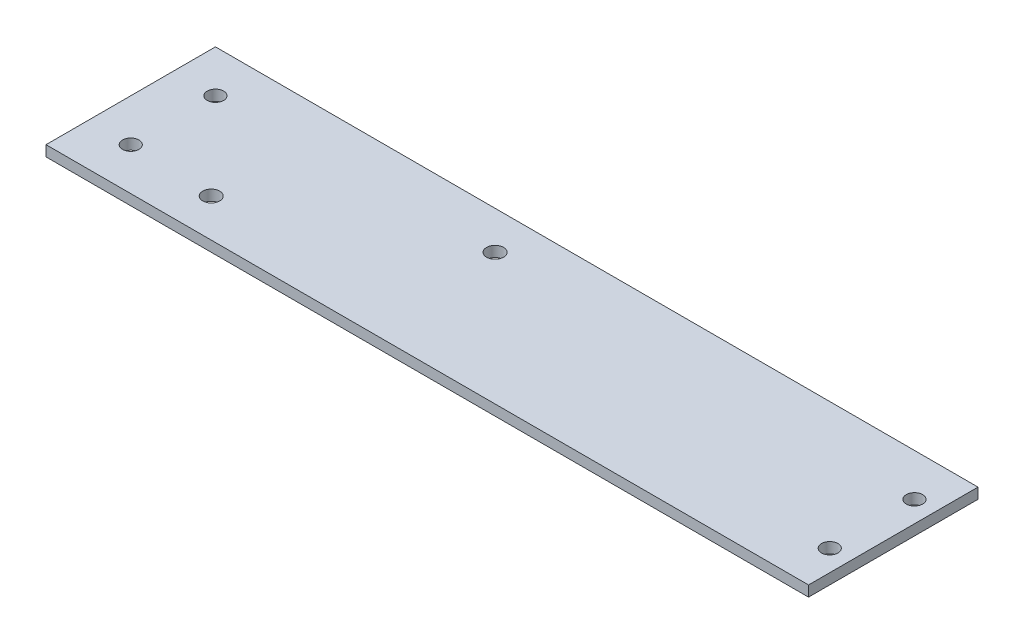
ISO-10303-21;
HEADER;
FILE_DESCRIPTION(('STEP AP214'),'2;1');
FILE_NAME('part.step','',(''),(''),'','','');
FILE_SCHEMA(('AUTOMOTIVE_DESIGN { 1 0 10303 214 1 1 1 1 }'));
ENDSEC;
DATA;
#1=APPLICATION_CONTEXT('core data for automotive mechanical design processes');
#2=APPLICATION_PROTOCOL_DEFINITION('international standard','automotive_design',2000,#1);
#3=PRODUCT_CONTEXT('',#1,'mechanical');
#4=PRODUCT('Part','Part','',(#3));
#5=PRODUCT_RELATED_PRODUCT_CATEGORY('part','',(#4));
#6=PRODUCT_DEFINITION_FORMATION('','',#4);
#7=PRODUCT_DEFINITION_CONTEXT('part definition',#1,'design');
#8=PRODUCT_DEFINITION('design','',#6,#7);
#9=PRODUCT_DEFINITION_SHAPE('','',#8);
#10=(LENGTH_UNIT() NAMED_UNIT(*) SI_UNIT(.MILLI.,.METRE.));
#11=(NAMED_UNIT(*) PLANE_ANGLE_UNIT() SI_UNIT($,.RADIAN.));
#12=(NAMED_UNIT(*) SI_UNIT($,.STERADIAN.) SOLID_ANGLE_UNIT());
#13=UNCERTAINTY_MEASURE_WITH_UNIT(LENGTH_MEASURE(1.E-05),#10,'distance_accuracy_value','');
#14=(GEOMETRIC_REPRESENTATION_CONTEXT(3) GLOBAL_UNCERTAINTY_ASSIGNED_CONTEXT((#13)) GLOBAL_UNIT_ASSIGNED_CONTEXT((#10,
#11,#12)) REPRESENTATION_CONTEXT('',''));
#15=CARTESIAN_POINT('',(0.,0.,0.));
#16=DIRECTION('',(0.,0.,1.));
#17=DIRECTION('',(1.,0.,0.));
#18=AXIS2_PLACEMENT_3D('',#15,#16,#17);
#19=CARTESIAN_POINT('',(-114.3,3.175,25.4));
#20=DIRECTION('',(1.,0.,0.));
#21=DIRECTION('',(0.,0.,-1.));
#22=AXIS2_PLACEMENT_3D('',#19,#20,#21);
#23=PLANE('',#22);
#24=DIRECTION('',(0.,0.,1.));
#25=VECTOR('',#24,1.);
#26=CARTESIAN_POINT('',(-114.3,0.,25.4));
#27=LINE('',#26,#25);
#28=CARTESIAN_POINT('',(-114.3,0.,-25.4));
#29=VERTEX_POINT('',#28);
#30=CARTESIAN_POINT('',(-114.3,0.,25.4));
#31=VERTEX_POINT('',#30);
#32=EDGE_CURVE('E107',#29,#31,#27,.T.);
#33=ORIENTED_EDGE('',*,*,#32,.T.);
#34=DIRECTION('',(0.,-1.,0.));
#35=VECTOR('',#34,1.);
#36=CARTESIAN_POINT('',(-114.3,3.175,25.4));
#37=LINE('',#36,#35);
#38=CARTESIAN_POINT('',(-114.3,3.175,25.4));
#39=VERTEX_POINT('',#38);
#40=EDGE_CURVE('E11',#39,#31,#37,.T.);
#41=ORIENTED_EDGE('',*,*,#40,.F.);
#42=DIRECTION('',(0.,0.,1.));
#43=VECTOR('',#42,1.);
#44=CARTESIAN_POINT('',(-114.3,3.175,25.4));
#45=LINE('',#44,#43);
#46=CARTESIAN_POINT('',(-114.3,3.175,-25.4));
#47=VERTEX_POINT('',#46);
#48=EDGE_CURVE('E91',#47,#39,#45,.T.);
#49=ORIENTED_EDGE('',*,*,#48,.F.);
#50=DIRECTION('',(0.,-1.,0.));
#51=VECTOR('',#50,1.);
#52=CARTESIAN_POINT('',(-114.3,3.175,-25.4));
#53=LINE('',#52,#51);
#54=EDGE_CURVE('E103',#47,#29,#53,.T.);
#55=ORIENTED_EDGE('',*,*,#54,.T.);
#56=EDGE_LOOP('',(#33,#41,#49,#55));
#57=FACE_BOUND('',#56,.T.);
#58=ADVANCED_FACE('F39',(#57),#23,.F.);
#59=CARTESIAN_POINT('',(114.3,3.175,25.4));
#60=DIRECTION('',(0.,0.,-1.));
#61=DIRECTION('',(-1.,0.,0.));
#62=AXIS2_PLACEMENT_3D('',#59,#60,#61);
#63=PLANE('',#62);
#64=DIRECTION('',(1.,0.,0.));
#65=VECTOR('',#64,1.);
#66=CARTESIAN_POINT('',(114.3,0.,25.4));
#67=LINE('',#66,#65);
#68=CARTESIAN_POINT('',(114.3,0.,25.4));
#69=VERTEX_POINT('',#68);
#70=EDGE_CURVE('E96',#31,#69,#67,.T.);
#71=ORIENTED_EDGE('',*,*,#70,.T.);
#72=DIRECTION('',(0.,-1.,0.));
#73=VECTOR('',#72,1.);
#74=CARTESIAN_POINT('',(114.3,3.175,25.4));
#75=LINE('',#74,#73);
#76=CARTESIAN_POINT('',(114.3,3.175,25.4));
#77=VERTEX_POINT('',#76);
#78=EDGE_CURVE('E48',#77,#69,#75,.T.);
#79=ORIENTED_EDGE('',*,*,#78,.F.);
#80=DIRECTION('',(1.,0.,0.));
#81=VECTOR('',#80,1.);
#82=CARTESIAN_POINT('',(114.3,3.175,25.4));
#83=LINE('',#82,#81);
#84=EDGE_CURVE('E86',#39,#77,#83,.T.);
#85=ORIENTED_EDGE('',*,*,#84,.F.);
#86=ORIENTED_EDGE('',*,*,#40,.T.);
#87=EDGE_LOOP('',(#71,#79,#85,#86));
#88=FACE_BOUND('',#87,.T.);
#89=ADVANCED_FACE('F95',(#88),#63,.F.);
#90=CARTESIAN_POINT('',(114.3,3.175,25.4));
#91=DIRECTION('',(-1.,0.,0.));
#92=DIRECTION('',(0.,0.,1.));
#93=AXIS2_PLACEMENT_3D('',#90,#91,#92);
#94=PLANE('',#93);
#95=DIRECTION('',(0.,0.,-1.));
#96=VECTOR('',#95,1.);
#97=CARTESIAN_POINT('',(114.3,0.,25.4));
#98=LINE('',#97,#96);
#99=CARTESIAN_POINT('',(114.3,0.,-25.4));
#100=VERTEX_POINT('',#99);
#101=EDGE_CURVE('E73',#69,#100,#98,.T.);
#102=ORIENTED_EDGE('',*,*,#101,.T.);
#103=DIRECTION('',(0.,-1.,0.));
#104=VECTOR('',#103,1.);
#105=CARTESIAN_POINT('',(114.3,3.175,-25.4));
#106=LINE('',#105,#104);
#107=CARTESIAN_POINT('',(114.3,3.175,-25.4));
#108=VERTEX_POINT('',#107);
#109=EDGE_CURVE('E98',#108,#100,#106,.T.);
#110=ORIENTED_EDGE('',*,*,#109,.F.);
#111=DIRECTION('',(0.,0.,-1.));
#112=VECTOR('',#111,1.);
#113=CARTESIAN_POINT('',(114.3,3.175,25.4));
#114=LINE('',#113,#112);
#115=EDGE_CURVE('E89',#77,#108,#114,.T.);
#116=ORIENTED_EDGE('',*,*,#115,.F.);
#117=ORIENTED_EDGE('',*,*,#78,.T.);
#118=EDGE_LOOP('',(#102,#110,#116,#117));
#119=FACE_BOUND('',#118,.T.);
#120=ADVANCED_FACE('F99',(#119),#94,.F.);
#121=CARTESIAN_POINT('',(114.3,3.175,-25.4));
#122=DIRECTION('',(0.,0.,1.));
#123=DIRECTION('',(1.,0.,0.));
#124=AXIS2_PLACEMENT_3D('',#121,#122,#123);
#125=PLANE('',#124);
#126=DIRECTION('',(-1.,0.,0.));
#127=VECTOR('',#126,1.);
#128=CARTESIAN_POINT('',(114.3,0.,-25.4));
#129=LINE('',#128,#127);
#130=EDGE_CURVE('E79',#100,#29,#129,.T.);
#131=ORIENTED_EDGE('',*,*,#130,.T.);
#132=ORIENTED_EDGE('',*,*,#54,.F.);
#133=DIRECTION('',(-1.,0.,0.));
#134=VECTOR('',#133,1.);
#135=CARTESIAN_POINT('',(114.3,3.175,-25.4));
#136=LINE('',#135,#134);
#137=EDGE_CURVE('E56',#108,#47,#136,.T.);
#138=ORIENTED_EDGE('',*,*,#137,.F.);
#139=ORIENTED_EDGE('',*,*,#109,.T.);
#140=EDGE_LOOP('',(#131,#132,#138,#139));
#141=FACE_BOUND('',#140,.T.);
#142=ADVANCED_FACE('F121',(#141),#125,.F.);
#143=CARTESIAN_POINT('',(0.,3.175,0.));
#144=DIRECTION('',(0.,1.,0.));
#145=DIRECTION('',(0.,0.,1.));
#146=AXIS2_PLACEMENT_3D('',#143,#144,#145);
#147=PLANE('',#146);
#148=CARTESIAN_POINT('',(-19.05,3.175,-13.9699999999621));
#149=DIRECTION('',(0.,1.,0.));
#150=DIRECTION('',(0.,0.,1.));
#151=AXIS2_PLACEMENT_3D('',#148,#149,#150);
#152=CIRCLE('',#151,2.5527);
#153=CARTESIAN_POINT('',(-19.05,3.175,-11.4172999999621));
#154=VERTEX_POINT('',#153);
#155=EDGE_CURVE('E171',#154,#154,#152,.T.);
#156=ORIENTED_EDGE('',*,*,#155,.F.);
#157=EDGE_LOOP('',(#156));
#158=FACE_BOUND('',#157,.T.);
#159=CARTESIAN_POINT('',(-76.2,3.175,13.9700000000379));
#160=DIRECTION('',(0.,1.,0.));
#161=DIRECTION('',(0.,0.,1.));
#162=AXIS2_PLACEMENT_3D('',#159,#160,#161);
#163=CIRCLE('',#162,2.55270000000001);
#164=CARTESIAN_POINT('',(-76.2,3.175,16.5227000000379));
#165=VERTEX_POINT('',#164);
#166=EDGE_CURVE('E163',#165,#165,#163,.T.);
#167=ORIENTED_EDGE('',*,*,#166,.F.);
#168=EDGE_LOOP('',(#167));
#169=FACE_BOUND('',#168,.T.);
#170=CARTESIAN_POINT('',(-101.6,3.175,12.7));
#171=DIRECTION('',(0.,1.,0.));
#172=DIRECTION('',(0.,0.,1.));
#173=AXIS2_PLACEMENT_3D('',#170,#171,#172);
#174=CIRCLE('',#173,2.45745);
#175=CARTESIAN_POINT('',(-101.6,3.175,15.15745));
#176=VERTEX_POINT('',#175);
#177=EDGE_CURVE('E155',#176,#176,#174,.T.);
#178=ORIENTED_EDGE('',*,*,#177,.F.);
#179=EDGE_LOOP('',(#178));
#180=FACE_BOUND('',#179,.T.);
#181=CARTESIAN_POINT('',(-101.6,3.175,-12.7));
#182=DIRECTION('',(0.,1.,0.));
#183=DIRECTION('',(0.,0.,1.));
#184=AXIS2_PLACEMENT_3D('',#181,#182,#183);
#185=CIRCLE('',#184,2.45745);
#186=CARTESIAN_POINT('',(-101.6,3.175,-10.24255));
#187=VERTEX_POINT('',#186);
#188=EDGE_CURVE('E147',#187,#187,#185,.T.);
#189=ORIENTED_EDGE('',*,*,#188,.F.);
#190=EDGE_LOOP('',(#189));
#191=FACE_BOUND('',#190,.T.);
#192=CARTESIAN_POINT('',(107.95,3.175,12.7));
#193=DIRECTION('',(0.,1.,0.));
#194=DIRECTION('',(0.,0.,1.));
#195=AXIS2_PLACEMENT_3D('',#192,#193,#194);
#196=CIRCLE('',#195,2.45745);
#197=CARTESIAN_POINT('',(107.95,3.175,15.15745));
#198=VERTEX_POINT('',#197);
#199=EDGE_CURVE('E139',#198,#198,#196,.T.);
#200=ORIENTED_EDGE('',*,*,#199,.F.);
#201=EDGE_LOOP('',(#200));
#202=FACE_BOUND('',#201,.T.);
#203=CARTESIAN_POINT('',(107.95,3.175,-12.7));
#204=DIRECTION('',(0.,1.,0.));
#205=DIRECTION('',(0.,0.,1.));
#206=AXIS2_PLACEMENT_3D('',#203,#204,#205);
#207=CIRCLE('',#206,2.45745);
#208=CARTESIAN_POINT('',(107.95,3.175,-10.24255));
#209=VERTEX_POINT('',#208);
#210=EDGE_CURVE('E131',#209,#209,#207,.T.);
#211=ORIENTED_EDGE('',*,*,#210,.F.);
#212=EDGE_LOOP('',(#211));
#213=FACE_BOUND('',#212,.T.);
#214=ORIENTED_EDGE('',*,*,#48,.T.);
#215=ORIENTED_EDGE('',*,*,#84,.T.);
#216=ORIENTED_EDGE('',*,*,#115,.T.);
#217=ORIENTED_EDGE('',*,*,#137,.T.);
#218=EDGE_LOOP('',(#214,#215,#216,#217));
#219=FACE_BOUND('',#218,.T.);
#220=ADVANCED_FACE('F87',(#158,#169,#180,#191,#202,#213,#219),#147,.T.);
#221=CARTESIAN_POINT('',(0.,0.,0.));
#222=DIRECTION('',(0.,1.,0.));
#223=DIRECTION('',(0.,0.,1.));
#224=AXIS2_PLACEMENT_3D('',#221,#222,#223);
#225=PLANE('',#224);
#226=CARTESIAN_POINT('',(-19.05,0.,-13.9699999999621));
#227=DIRECTION('',(0.,1.,0.));
#228=DIRECTION('',(0.,0.,1.));
#229=AXIS2_PLACEMENT_3D('',#226,#227,#228);
#230=CIRCLE('',#229,2.5527);
#231=CARTESIAN_POINT('',(-19.05,0.,-11.4172999999621));
#232=VERTEX_POINT('',#231);
#233=EDGE_CURVE('E167',#232,#232,#230,.T.);
#234=ORIENTED_EDGE('',*,*,#233,.T.);
#235=EDGE_LOOP('',(#234));
#236=FACE_BOUND('',#235,.T.);
#237=CARTESIAN_POINT('',(-76.2,0.,13.9700000000379));
#238=DIRECTION('',(0.,1.,0.));
#239=DIRECTION('',(0.,0.,1.));
#240=AXIS2_PLACEMENT_3D('',#237,#238,#239);
#241=CIRCLE('',#240,2.55270000000001);
#242=CARTESIAN_POINT('',(-76.2,0.,16.5227000000379));
#243=VERTEX_POINT('',#242);
#244=EDGE_CURVE('E159',#243,#243,#241,.T.);
#245=ORIENTED_EDGE('',*,*,#244,.T.);
#246=EDGE_LOOP('',(#245));
#247=FACE_BOUND('',#246,.T.);
#248=CARTESIAN_POINT('',(-101.6,0.,12.7));
#249=DIRECTION('',(0.,1.,0.));
#250=DIRECTION('',(0.,0.,1.));
#251=AXIS2_PLACEMENT_3D('',#248,#249,#250);
#252=CIRCLE('',#251,2.45745);
#253=CARTESIAN_POINT('',(-101.6,0.,15.15745));
#254=VERTEX_POINT('',#253);
#255=EDGE_CURVE('E151',#254,#254,#252,.T.);
#256=ORIENTED_EDGE('',*,*,#255,.T.);
#257=EDGE_LOOP('',(#256));
#258=FACE_BOUND('',#257,.T.);
#259=CARTESIAN_POINT('',(-101.6,0.,-12.7));
#260=DIRECTION('',(0.,1.,0.));
#261=DIRECTION('',(0.,0.,1.));
#262=AXIS2_PLACEMENT_3D('',#259,#260,#261);
#263=CIRCLE('',#262,2.45745);
#264=CARTESIAN_POINT('',(-101.6,0.,-10.24255));
#265=VERTEX_POINT('',#264);
#266=EDGE_CURVE('E143',#265,#265,#263,.T.);
#267=ORIENTED_EDGE('',*,*,#266,.T.);
#268=EDGE_LOOP('',(#267));
#269=FACE_BOUND('',#268,.T.);
#270=CARTESIAN_POINT('',(107.95,0.,12.7));
#271=DIRECTION('',(0.,1.,0.));
#272=DIRECTION('',(0.,0.,1.));
#273=AXIS2_PLACEMENT_3D('',#270,#271,#272);
#274=CIRCLE('',#273,2.45745);
#275=CARTESIAN_POINT('',(107.95,0.,15.15745));
#276=VERTEX_POINT('',#275);
#277=EDGE_CURVE('E135',#276,#276,#274,.T.);
#278=ORIENTED_EDGE('',*,*,#277,.T.);
#279=EDGE_LOOP('',(#278));
#280=FACE_BOUND('',#279,.T.);
#281=CARTESIAN_POINT('',(107.95,0.,-12.7));
#282=DIRECTION('',(0.,1.,0.));
#283=DIRECTION('',(0.,0.,1.));
#284=AXIS2_PLACEMENT_3D('',#281,#282,#283);
#285=CIRCLE('',#284,2.45745);
#286=CARTESIAN_POINT('',(107.95,0.,-10.24255));
#287=VERTEX_POINT('',#286);
#288=EDGE_CURVE('E111',#287,#287,#285,.T.);
#289=ORIENTED_EDGE('',*,*,#288,.T.);
#290=EDGE_LOOP('',(#289));
#291=FACE_BOUND('',#290,.T.);
#292=ORIENTED_EDGE('',*,*,#32,.F.);
#293=ORIENTED_EDGE('',*,*,#130,.F.);
#294=ORIENTED_EDGE('',*,*,#101,.F.);
#295=ORIENTED_EDGE('',*,*,#70,.F.);
#296=EDGE_LOOP('',(#292,#293,#294,#295));
#297=FACE_BOUND('',#296,.T.);
#298=ADVANCED_FACE('F124',(#236,#247,#258,#269,#280,#291,#297),#225,.F.);
#299=CARTESIAN_POINT('',(107.95,3.175,-12.7));
#300=DIRECTION('',(0.,1.,0.));
#301=DIRECTION('',(0.,0.,1.));
#302=AXIS2_PLACEMENT_3D('',#299,#300,#301);
#303=CYLINDRICAL_SURFACE('',#302,2.45745);
#304=ORIENTED_EDGE('',*,*,#288,.F.);
#305=EDGE_LOOP('',(#304));
#306=FACE_BOUND('',#305,.T.);
#307=ORIENTED_EDGE('',*,*,#210,.T.);
#308=EDGE_LOOP('',(#307));
#309=FACE_BOUND('',#308,.T.);
#310=ADVANCED_FACE('F191',(#306,#309),#303,.F.);
#311=CARTESIAN_POINT('',(107.95,3.175,12.7));
#312=DIRECTION('',(0.,1.,0.));
#313=DIRECTION('',(0.,0.,1.));
#314=AXIS2_PLACEMENT_3D('',#311,#312,#313);
#315=CYLINDRICAL_SURFACE('',#314,2.45745);
#316=ORIENTED_EDGE('',*,*,#277,.F.);
#317=EDGE_LOOP('',(#316));
#318=FACE_BOUND('',#317,.T.);
#319=ORIENTED_EDGE('',*,*,#199,.T.);
#320=EDGE_LOOP('',(#319));
#321=FACE_BOUND('',#320,.T.);
#322=ADVANCED_FACE('F193',(#318,#321),#315,.F.);
#323=CARTESIAN_POINT('',(-101.6,3.175,-12.7));
#324=DIRECTION('',(0.,1.,0.));
#325=DIRECTION('',(0.,0.,1.));
#326=AXIS2_PLACEMENT_3D('',#323,#324,#325);
#327=CYLINDRICAL_SURFACE('',#326,2.45745);
#328=ORIENTED_EDGE('',*,*,#266,.F.);
#329=EDGE_LOOP('',(#328));
#330=FACE_BOUND('',#329,.T.);
#331=ORIENTED_EDGE('',*,*,#188,.T.);
#332=EDGE_LOOP('',(#331));
#333=FACE_BOUND('',#332,.T.);
#334=ADVANCED_FACE('F200',(#330,#333),#327,.F.);
#335=CARTESIAN_POINT('',(-101.6,3.175,12.7));
#336=DIRECTION('',(0.,1.,0.));
#337=DIRECTION('',(0.,0.,1.));
#338=AXIS2_PLACEMENT_3D('',#335,#336,#337);
#339=CYLINDRICAL_SURFACE('',#338,2.45745);
#340=ORIENTED_EDGE('',*,*,#255,.F.);
#341=EDGE_LOOP('',(#340));
#342=FACE_BOUND('',#341,.T.);
#343=ORIENTED_EDGE('',*,*,#177,.T.);
#344=EDGE_LOOP('',(#343));
#345=FACE_BOUND('',#344,.T.);
#346=ADVANCED_FACE('F240',(#342,#345),#339,.F.);
#347=CARTESIAN_POINT('',(-76.2,3.175,13.9700000000379));
#348=DIRECTION('',(0.,1.,0.));
#349=DIRECTION('',(0.,0.,1.));
#350=AXIS2_PLACEMENT_3D('',#347,#348,#349);
#351=CYLINDRICAL_SURFACE('',#350,2.55270000000001);
#352=ORIENTED_EDGE('',*,*,#244,.F.);
#353=EDGE_LOOP('',(#352));
#354=FACE_BOUND('',#353,.T.);
#355=ORIENTED_EDGE('',*,*,#166,.T.);
#356=EDGE_LOOP('',(#355));
#357=FACE_BOUND('',#356,.T.);
#358=ADVANCED_FACE('F235',(#354,#357),#351,.F.);
#359=CARTESIAN_POINT('',(-19.05,3.175,-13.9699999999621));
#360=DIRECTION('',(0.,1.,0.));
#361=DIRECTION('',(0.,0.,1.));
#362=AXIS2_PLACEMENT_3D('',#359,#360,#361);
#363=CYLINDRICAL_SURFACE('',#362,2.5527);
#364=ORIENTED_EDGE('',*,*,#233,.F.);
#365=EDGE_LOOP('',(#364));
#366=FACE_BOUND('',#365,.T.);
#367=ORIENTED_EDGE('',*,*,#155,.T.);
#368=EDGE_LOOP('',(#367));
#369=FACE_BOUND('',#368,.T.);
#370=ADVANCED_FACE('F176',(#366,#369),#363,.F.);
#371=CLOSED_SHELL('',(#58,#89,#120,#142,#220,#298,#310,#322,#334,#346,#358,#370));
#372=MANIFOLD_SOLID_BREP('B2',#371);
#373=ADVANCED_BREP_SHAPE_REPRESENTATION('',(#18,#372),#14);
#374=SHAPE_DEFINITION_REPRESENTATION(#9,#373);
ENDSEC;
END-ISO-10303-21;
